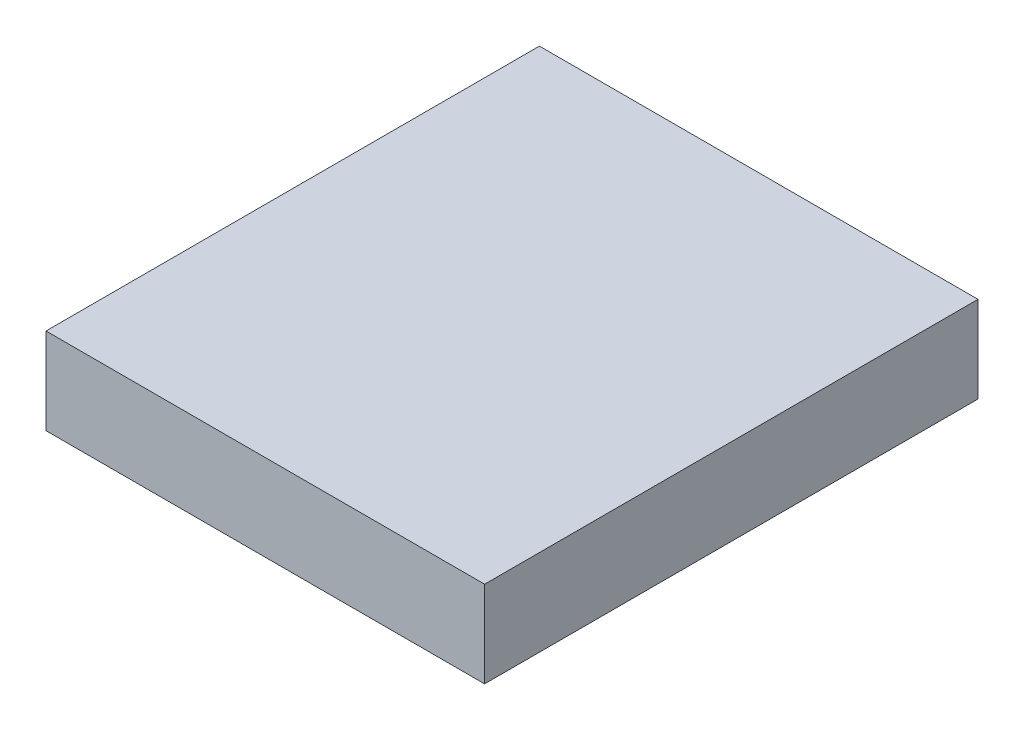
ISO-10303-21;
HEADER;
FILE_DESCRIPTION(('STEP AP214'),'2;1');
FILE_NAME('part.step','',(''),(''),'','','');
FILE_SCHEMA(('AUTOMOTIVE_DESIGN { 1 0 10303 214 1 1 1 1 }'));
ENDSEC;
DATA;
#1=APPLICATION_CONTEXT('core data for automotive mechanical design processes');
#2=APPLICATION_PROTOCOL_DEFINITION('international standard','automotive_design',2000,#1);
#3=PRODUCT_CONTEXT('',#1,'mechanical');
#4=PRODUCT('Part','Part','',(#3));
#5=PRODUCT_RELATED_PRODUCT_CATEGORY('part','',(#4));
#6=PRODUCT_DEFINITION_FORMATION('','',#4);
#7=PRODUCT_DEFINITION_CONTEXT('part definition',#1,'design');
#8=PRODUCT_DEFINITION('design','',#6,#7);
#9=PRODUCT_DEFINITION_SHAPE('','',#8);
#10=(LENGTH_UNIT() NAMED_UNIT(*) SI_UNIT(.MILLI.,.METRE.));
#11=(NAMED_UNIT(*) PLANE_ANGLE_UNIT() SI_UNIT($,.RADIAN.));
#12=(NAMED_UNIT(*) SI_UNIT($,.STERADIAN.) SOLID_ANGLE_UNIT());
#13=UNCERTAINTY_MEASURE_WITH_UNIT(LENGTH_MEASURE(1.E-05),#10,'distance_accuracy_value','');
#14=(GEOMETRIC_REPRESENTATION_CONTEXT(3) GLOBAL_UNCERTAINTY_ASSIGNED_CONTEXT((#13)) GLOBAL_UNIT_ASSIGNED_CONTEXT((#10,
#11,#12)) REPRESENTATION_CONTEXT('',''));
#15=CARTESIAN_POINT('',(0.,0.,0.));
#16=DIRECTION('',(0.,0.,1.));
#17=DIRECTION('',(1.,0.,0.));
#18=AXIS2_PLACEMENT_3D('',#15,#16,#17);
#19=CARTESIAN_POINT('',(50.8,20.,57.15));
#20=DIRECTION('',(-1.,0.,0.));
#21=DIRECTION('',(0.,0.,1.));
#22=AXIS2_PLACEMENT_3D('',#19,#20,#21);
#23=PLANE('',#22);
#24=DIRECTION('',(0.,0.,-1.));
#25=VECTOR('',#24,1.);
#26=CARTESIAN_POINT('',(50.8,0.,57.15));
#27=LINE('',#26,#25);
#28=CARTESIAN_POINT('',(50.8,0.,57.15));
#29=VERTEX_POINT('',#28);
#30=CARTESIAN_POINT('',(50.8,0.,-57.15));
#31=VERTEX_POINT('',#30);
#32=EDGE_CURVE('E94',#29,#31,#27,.T.);
#33=ORIENTED_EDGE('',*,*,#32,.T.);
#34=DIRECTION('',(0.,-1.,0.));
#35=VECTOR('',#34,1.);
#36=CARTESIAN_POINT('',(50.8,20.,-57.15));
#37=LINE('',#36,#35);
#38=CARTESIAN_POINT('',(50.8,20.,-57.15));
#39=VERTEX_POINT('',#38);
#40=EDGE_CURVE('E11',#39,#31,#37,.T.);
#41=ORIENTED_EDGE('',*,*,#40,.F.);
#42=DIRECTION('',(0.,0.,-1.));
#43=VECTOR('',#42,1.);
#44=CARTESIAN_POINT('',(50.8,20.,57.15));
#45=LINE('',#44,#43);
#46=CARTESIAN_POINT('',(50.8,20.,57.15));
#47=VERTEX_POINT('',#46);
#48=EDGE_CURVE('E82',#47,#39,#45,.T.);
#49=ORIENTED_EDGE('',*,*,#48,.F.);
#50=DIRECTION('',(0.,-1.,0.));
#51=VECTOR('',#50,1.);
#52=CARTESIAN_POINT('',(50.8,20.,57.15));
#53=LINE('',#52,#51);
#54=EDGE_CURVE('E90',#47,#29,#53,.T.);
#55=ORIENTED_EDGE('',*,*,#54,.T.);
#56=EDGE_LOOP('',(#33,#41,#49,#55));
#57=FACE_BOUND('',#56,.T.);
#58=ADVANCED_FACE('F31',(#57),#23,.F.);
#59=CARTESIAN_POINT('',(-50.8,20.,-57.15));
#60=DIRECTION('',(0.,0.,1.));
#61=DIRECTION('',(1.,0.,0.));
#62=AXIS2_PLACEMENT_3D('',#59,#60,#61);
#63=PLANE('',#62);
#64=DIRECTION('',(-1.,0.,0.));
#65=VECTOR('',#64,1.);
#66=CARTESIAN_POINT('',(-50.8,0.,-57.15));
#67=LINE('',#66,#65);
#68=CARTESIAN_POINT('',(-50.8,0.,-57.15));
#69=VERTEX_POINT('',#68);
#70=EDGE_CURVE('E86',#31,#69,#67,.T.);
#71=ORIENTED_EDGE('',*,*,#70,.T.);
#72=DIRECTION('',(0.,-1.,0.));
#73=VECTOR('',#72,1.);
#74=CARTESIAN_POINT('',(-50.8,20.,-57.15));
#75=LINE('',#74,#73);
#76=CARTESIAN_POINT('',(-50.8,20.,-57.15));
#77=VERTEX_POINT('',#76);
#78=EDGE_CURVE('E39',#77,#69,#75,.T.);
#79=ORIENTED_EDGE('',*,*,#78,.F.);
#80=DIRECTION('',(-1.,0.,0.));
#81=VECTOR('',#80,1.);
#82=CARTESIAN_POINT('',(-50.8,20.,-57.15));
#83=LINE('',#82,#81);
#84=EDGE_CURVE('E77',#39,#77,#83,.T.);
#85=ORIENTED_EDGE('',*,*,#84,.F.);
#86=ORIENTED_EDGE('',*,*,#40,.T.);
#87=EDGE_LOOP('',(#71,#79,#85,#86));
#88=FACE_BOUND('',#87,.T.);
#89=ADVANCED_FACE('F85',(#88),#63,.F.);
#90=CARTESIAN_POINT('',(-50.8,20.,57.15));
#91=DIRECTION('',(1.,0.,0.));
#92=DIRECTION('',(0.,0.,-1.));
#93=AXIS2_PLACEMENT_3D('',#90,#91,#92);
#94=PLANE('',#93);
#95=DIRECTION('',(0.,0.,1.));
#96=VECTOR('',#95,1.);
#97=CARTESIAN_POINT('',(-50.8,0.,57.15));
#98=LINE('',#97,#96);
#99=CARTESIAN_POINT('',(-50.8,0.,57.15));
#100=VERTEX_POINT('',#99);
#101=EDGE_CURVE('E64',#69,#100,#98,.T.);
#102=ORIENTED_EDGE('',*,*,#101,.T.);
#103=DIRECTION('',(0.,-1.,0.));
#104=VECTOR('',#103,1.);
#105=CARTESIAN_POINT('',(-50.8,20.,57.15));
#106=LINE('',#105,#104);
#107=CARTESIAN_POINT('',(-50.8,20.,57.15));
#108=VERTEX_POINT('',#107);
#109=EDGE_CURVE('E87',#108,#100,#106,.T.);
#110=ORIENTED_EDGE('',*,*,#109,.F.);
#111=DIRECTION('',(0.,0.,1.));
#112=VECTOR('',#111,1.);
#113=CARTESIAN_POINT('',(-50.8,20.,57.15));
#114=LINE('',#113,#112);
#115=EDGE_CURVE('E80',#77,#108,#114,.T.);
#116=ORIENTED_EDGE('',*,*,#115,.F.);
#117=ORIENTED_EDGE('',*,*,#78,.T.);
#118=EDGE_LOOP('',(#102,#110,#116,#117));
#119=FACE_BOUND('',#118,.T.);
#120=ADVANCED_FACE('F88',(#119),#94,.F.);
#121=CARTESIAN_POINT('',(-50.8,20.,57.15));
#122=DIRECTION('',(0.,0.,-1.));
#123=DIRECTION('',(-1.,0.,0.));
#124=AXIS2_PLACEMENT_3D('',#121,#122,#123);
#125=PLANE('',#124);
#126=DIRECTION('',(1.,0.,0.));
#127=VECTOR('',#126,1.);
#128=CARTESIAN_POINT('',(-50.8,0.,57.15));
#129=LINE('',#128,#127);
#130=EDGE_CURVE('E70',#100,#29,#129,.T.);
#131=ORIENTED_EDGE('',*,*,#130,.T.);
#132=ORIENTED_EDGE('',*,*,#54,.F.);
#133=DIRECTION('',(1.,0.,0.));
#134=VECTOR('',#133,1.);
#135=CARTESIAN_POINT('',(-50.8,20.,57.15));
#136=LINE('',#135,#134);
#137=EDGE_CURVE('E47',#108,#47,#136,.T.);
#138=ORIENTED_EDGE('',*,*,#137,.F.);
#139=ORIENTED_EDGE('',*,*,#109,.T.);
#140=EDGE_LOOP('',(#131,#132,#138,#139));
#141=FACE_BOUND('',#140,.T.);
#142=ADVANCED_FACE('F101',(#141),#125,.F.);
#143=CARTESIAN_POINT('',(50.8,20.,-57.15));
#144=DIRECTION('',(0.,-1.,0.));
#145=DIRECTION('',(0.,0.,-1.));
#146=AXIS2_PLACEMENT_3D('',#143,#144,#145);
#147=PLANE('',#146);
#148=ORIENTED_EDGE('',*,*,#48,.T.);
#149=ORIENTED_EDGE('',*,*,#84,.T.);
#150=ORIENTED_EDGE('',*,*,#115,.T.);
#151=ORIENTED_EDGE('',*,*,#137,.T.);
#152=EDGE_LOOP('',(#148,#149,#150,#151));
#153=FACE_BOUND('',#152,.T.);
#154=ADVANCED_FACE('F78',(#153),#147,.F.);
#155=CARTESIAN_POINT('',(50.8,0.,-57.15));
#156=DIRECTION('',(0.,-1.,0.));
#157=DIRECTION('',(0.,0.,-1.));
#158=AXIS2_PLACEMENT_3D('',#155,#156,#157);
#159=PLANE('',#158);
#160=ORIENTED_EDGE('',*,*,#32,.F.);
#161=ORIENTED_EDGE('',*,*,#130,.F.);
#162=ORIENTED_EDGE('',*,*,#101,.F.);
#163=ORIENTED_EDGE('',*,*,#70,.F.);
#164=EDGE_LOOP('',(#160,#161,#162,#163));
#165=FACE_BOUND('',#164,.T.);
#166=ADVANCED_FACE('F104',(#165),#159,.T.);
#167=CLOSED_SHELL('',(#58,#89,#120,#142,#154,#166));
#168=MANIFOLD_SOLID_BREP('B2',#167);
#169=ADVANCED_BREP_SHAPE_REPRESENTATION('',(#18,#168),#14);
#170=SHAPE_DEFINITION_REPRESENTATION(#9,#169);
ENDSEC;
END-ISO-10303-21;
